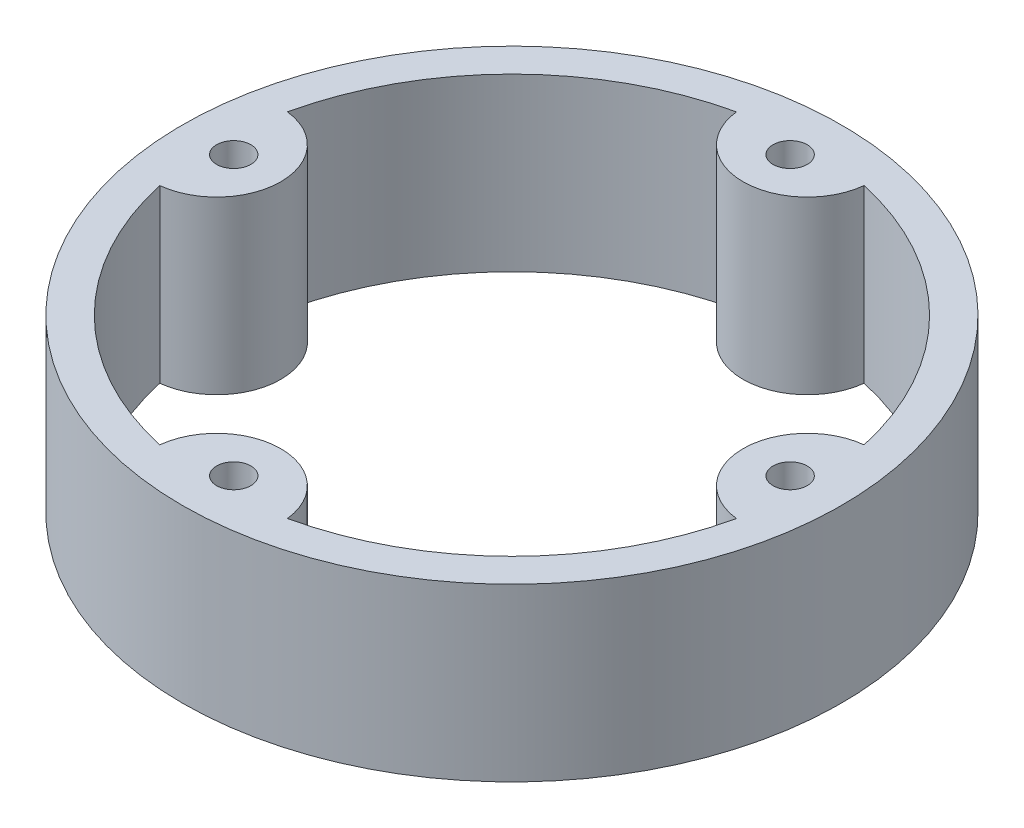
ISO-10303-21;
HEADER;
FILE_DESCRIPTION(('STEP AP214'),'2;1');
FILE_NAME('part.step','',(''),(''),'','','');
FILE_SCHEMA(('AUTOMOTIVE_DESIGN { 1 0 10303 214 1 1 1 1 }'));
ENDSEC;
DATA;
#1=APPLICATION_CONTEXT('core data for automotive mechanical design processes');
#2=APPLICATION_PROTOCOL_DEFINITION('international standard','automotive_design',2000,#1);
#3=PRODUCT_CONTEXT('',#1,'mechanical');
#4=PRODUCT('Part','Part','',(#3));
#5=PRODUCT_RELATED_PRODUCT_CATEGORY('part','',(#4));
#6=PRODUCT_DEFINITION_FORMATION('','',#4);
#7=PRODUCT_DEFINITION_CONTEXT('part definition',#1,'design');
#8=PRODUCT_DEFINITION('design','',#6,#7);
#9=PRODUCT_DEFINITION_SHAPE('','',#8);
#10=(LENGTH_UNIT() NAMED_UNIT(*) SI_UNIT(.MILLI.,.METRE.));
#11=(NAMED_UNIT(*) PLANE_ANGLE_UNIT() SI_UNIT($,.RADIAN.));
#12=(NAMED_UNIT(*) SI_UNIT($,.STERADIAN.) SOLID_ANGLE_UNIT());
#13=UNCERTAINTY_MEASURE_WITH_UNIT(LENGTH_MEASURE(1.E-05),#10,'distance_accuracy_value','');
#14=(GEOMETRIC_REPRESENTATION_CONTEXT(3) GLOBAL_UNCERTAINTY_ASSIGNED_CONTEXT((#13)) GLOBAL_UNIT_ASSIGNED_CONTEXT((#10,
#11,#12)) REPRESENTATION_CONTEXT('',''));
#15=CARTESIAN_POINT('',(0.,0.,0.));
#16=DIRECTION('',(0.,0.,1.));
#17=DIRECTION('',(1.,0.,0.));
#18=AXIS2_PLACEMENT_3D('',#15,#16,#17);
#19=CARTESIAN_POINT('',(0.,20.,0.));
#20=DIRECTION('',(0.,1.,0.));
#21=DIRECTION('',(0.,0.,1.));
#22=AXIS2_PLACEMENT_3D('',#19,#20,#21);
#23=PLANE('',#22);
#24=CARTESIAN_POINT('',(0.,20.,32.4999999999998));
#25=DIRECTION('',(0.,1.,0.));
#26=DIRECTION('',(0.,0.,1.));
#27=AXIS2_PLACEMENT_3D('',#24,#25,#26);
#28=CIRCLE('',#27,2.00000000000028);
#29=CARTESIAN_POINT('',(0.,20.,34.5000000000001));
#30=VERTEX_POINT('',#29);
#31=EDGE_CURVE('E193',#30,#30,#28,.T.);
#32=ORIENTED_EDGE('',*,*,#31,.F.);
#33=EDGE_LOOP('',(#32));
#34=FACE_BOUND('',#33,.T.);
#35=CARTESIAN_POINT('',(-34.5,20.,0.));
#36=DIRECTION('',(0.,-1.,0.));
#37=DIRECTION('',(0.,0.,1.));
#38=AXIS2_PLACEMENT_3D('',#35,#36,#37);
#39=CIRCLE('',#38,7.49999999999979);
#40=CARTESIAN_POINT('',(-33.6847826086957,20.,-7.4555630642435));
#41=VERTEX_POINT('',#40);
#42=CARTESIAN_POINT('',(-33.6847826086957,20.,7.4555630642435));
#43=VERTEX_POINT('',#42);
#44=EDGE_CURVE('E106',#41,#43,#39,.T.);
#45=ORIENTED_EDGE('',*,*,#44,.F.);
#46=CARTESIAN_POINT('',(0.,20.,0.));
#47=DIRECTION('',(0.,1.,0.));
#48=DIRECTION('',(0.,0.,1.));
#49=AXIS2_PLACEMENT_3D('',#46,#47,#48);
#50=CIRCLE('',#49,34.5);
#51=CARTESIAN_POINT('',(-7.45556306424351,20.,-33.6847826086957));
#52=VERTEX_POINT('',#51);
#53=EDGE_CURVE('E98',#52,#41,#50,.T.);
#54=ORIENTED_EDGE('',*,*,#53,.F.);
#55=CARTESIAN_POINT('',(0.,20.,-34.5));
#56=DIRECTION('',(0.,-1.,0.));
#57=DIRECTION('',(0.,0.,1.));
#58=AXIS2_PLACEMENT_3D('',#55,#56,#57);
#59=CIRCLE('',#58,7.49999999999981);
#60=CARTESIAN_POINT('',(7.45556306424352,20.,-33.6847826086957));
#61=VERTEX_POINT('',#60);
#62=EDGE_CURVE('E133',#61,#52,#59,.T.);
#63=ORIENTED_EDGE('',*,*,#62,.F.);
#64=CARTESIAN_POINT('',(0.,20.,0.));
#65=DIRECTION('',(0.,1.,0.));
#66=DIRECTION('',(0.,0.,1.));
#67=AXIS2_PLACEMENT_3D('',#64,#65,#66);
#68=CIRCLE('',#67,34.5);
#69=CARTESIAN_POINT('',(33.6847826086957,20.,-7.45556306424345));
#70=VERTEX_POINT('',#69);
#71=EDGE_CURVE('E131',#70,#61,#68,.T.);
#72=ORIENTED_EDGE('',*,*,#71,.F.);
#73=CARTESIAN_POINT('',(34.5,20.,0.));
#74=DIRECTION('',(0.,-1.,0.));
#75=DIRECTION('',(0.,0.,1.));
#76=AXIS2_PLACEMENT_3D('',#73,#74,#75);
#77=CIRCLE('',#76,7.49999999999974);
#78=CARTESIAN_POINT('',(33.6847826086957,20.,7.4555630642435));
#79=VERTEX_POINT('',#78);
#80=EDGE_CURVE('E129',#79,#70,#77,.T.);
#81=ORIENTED_EDGE('',*,*,#80,.F.);
#82=CARTESIAN_POINT('',(0.,20.,0.));
#83=DIRECTION('',(0.,1.,0.));
#84=DIRECTION('',(0.,0.,1.));
#85=AXIS2_PLACEMENT_3D('',#82,#83,#84);
#86=CIRCLE('',#85,34.5);
#87=CARTESIAN_POINT('',(7.4555630642438,20.,33.6847826086957));
#88=VERTEX_POINT('',#87);
#89=EDGE_CURVE('E127',#88,#79,#86,.T.);
#90=ORIENTED_EDGE('',*,*,#89,.F.);
#91=CARTESIAN_POINT('',(0.,20.,34.5));
#92=DIRECTION('',(0.,-1.,0.));
#93=DIRECTION('',(0.,0.,1.));
#94=AXIS2_PLACEMENT_3D('',#91,#92,#93);
#95=CIRCLE('',#94,7.50000000000009);
#96=CARTESIAN_POINT('',(-7.45556306424408,20.,33.6847826086956));
#97=VERTEX_POINT('',#96);
#98=EDGE_CURVE('E122',#97,#88,#95,.T.);
#99=ORIENTED_EDGE('',*,*,#98,.F.);
#100=CARTESIAN_POINT('',(0.,20.,0.));
#101=DIRECTION('',(0.,1.,0.));
#102=DIRECTION('',(0.,0.,1.));
#103=AXIS2_PLACEMENT_3D('',#100,#101,#102);
#104=CIRCLE('',#103,34.5);
#105=EDGE_CURVE('E120',#43,#97,#104,.T.);
#106=ORIENTED_EDGE('',*,*,#105,.F.);
#107=EDGE_LOOP('',(#45,#54,#63,#72,#81,#90,#99,#106));
#108=FACE_BOUND('',#107,.T.);
#109=CARTESIAN_POINT('',(0.,20.,-32.4999999999998));
#110=DIRECTION('',(0.,1.,0.));
#111=DIRECTION('',(0.,0.,1.));
#112=AXIS2_PLACEMENT_3D('',#109,#110,#111);
#113=CIRCLE('',#112,2.00000000000005);
#114=CARTESIAN_POINT('',(0.,20.,-30.4999999999998));
#115=VERTEX_POINT('',#114);
#116=EDGE_CURVE('E166',#115,#115,#113,.T.);
#117=ORIENTED_EDGE('',*,*,#116,.F.);
#118=EDGE_LOOP('',(#117));
#119=FACE_BOUND('',#118,.T.);
#120=CARTESIAN_POINT('',(0.,20.,0.));
#121=DIRECTION('',(0.,1.,0.));
#122=DIRECTION('',(0.,0.,1.));
#123=AXIS2_PLACEMENT_3D('',#120,#121,#122);
#124=CIRCLE('',#123,38.5);
#125=CARTESIAN_POINT('',(0.,20.,38.5));
#126=VERTEX_POINT('',#125);
#127=EDGE_CURVE('E11',#126,#126,#124,.T.);
#128=ORIENTED_EDGE('',*,*,#127,.T.);
#129=EDGE_LOOP('',(#128));
#130=FACE_BOUND('',#129,.T.);
#131=CARTESIAN_POINT('',(32.4999999999998,20.,0.));
#132=DIRECTION('',(0.,1.,0.));
#133=DIRECTION('',(0.,0.,1.));
#134=AXIS2_PLACEMENT_3D('',#131,#132,#133);
#135=CIRCLE('',#134,2.00000000000017);
#136=CARTESIAN_POINT('',(32.4999999999998,20.,2.00000000000016));
#137=VERTEX_POINT('',#136);
#138=EDGE_CURVE('E136',#137,#137,#135,.T.);
#139=ORIENTED_EDGE('',*,*,#138,.F.);
#140=EDGE_LOOP('',(#139));
#141=FACE_BOUND('',#140,.T.);
#142=CARTESIAN_POINT('',(-32.4999999999998,20.,0.));
#143=DIRECTION('',(0.,1.,0.));
#144=DIRECTION('',(0.,0.,1.));
#145=AXIS2_PLACEMENT_3D('',#142,#143,#144);
#146=CIRCLE('',#145,2.0000000000004);
#147=CARTESIAN_POINT('',(-32.4999999999998,20.,2.00000000000042));
#148=VERTEX_POINT('',#147);
#149=EDGE_CURVE('E200',#148,#148,#146,.T.);
#150=ORIENTED_EDGE('',*,*,#149,.F.);
#151=EDGE_LOOP('',(#150));
#152=FACE_BOUND('',#151,.T.);
#153=ADVANCED_FACE('F33',(#34,#108,#119,#130,#141,#152),#23,.T.);
#154=CARTESIAN_POINT('',(0.,0.,0.));
#155=DIRECTION('',(0.,1.,0.));
#156=DIRECTION('',(0.,0.,1.));
#157=AXIS2_PLACEMENT_3D('',#154,#155,#156);
#158=PLANE('',#157);
#159=CARTESIAN_POINT('',(0.,0.,-32.4999999999998));
#160=DIRECTION('',(0.,1.,0.));
#161=DIRECTION('',(0.,0.,1.));
#162=AXIS2_PLACEMENT_3D('',#159,#160,#161);
#163=CIRCLE('',#162,2.00000000000005);
#164=CARTESIAN_POINT('',(0.,0.,-30.4999999999998));
#165=VERTEX_POINT('',#164);
#166=EDGE_CURVE('E114',#165,#165,#163,.T.);
#167=ORIENTED_EDGE('',*,*,#166,.T.);
#168=EDGE_LOOP('',(#167));
#169=FACE_BOUND('',#168,.T.);
#170=CARTESIAN_POINT('',(0.,0.,0.));
#171=DIRECTION('',(0.,1.,0.));
#172=DIRECTION('',(0.,0.,1.));
#173=AXIS2_PLACEMENT_3D('',#170,#171,#172);
#174=CIRCLE('',#173,38.5);
#175=CARTESIAN_POINT('',(0.,0.,38.5));
#176=VERTEX_POINT('',#175);
#177=EDGE_CURVE('E37',#176,#176,#174,.T.);
#178=ORIENTED_EDGE('',*,*,#177,.F.);
#179=EDGE_LOOP('',(#178));
#180=FACE_BOUND('',#179,.T.);
#181=CARTESIAN_POINT('',(0.,0.,0.));
#182=DIRECTION('',(0.,1.,0.));
#183=DIRECTION('',(0.,0.,1.));
#184=AXIS2_PLACEMENT_3D('',#181,#182,#183);
#185=CIRCLE('',#184,34.5);
#186=CARTESIAN_POINT('',(-7.45556306424351,0.,-33.6847826086957));
#187=VERTEX_POINT('',#186);
#188=CARTESIAN_POINT('',(-33.6847826086957,0.,-7.4555630642435));
#189=VERTEX_POINT('',#188);
#190=EDGE_CURVE('E56',#187,#189,#185,.T.);
#191=ORIENTED_EDGE('',*,*,#190,.T.);
#192=CARTESIAN_POINT('',(-34.5,0.,0.));
#193=DIRECTION('',(0.,-1.,0.));
#194=DIRECTION('',(0.,0.,1.));
#195=AXIS2_PLACEMENT_3D('',#192,#193,#194);
#196=CIRCLE('',#195,7.49999999999979);
#197=CARTESIAN_POINT('',(-33.6847826086957,0.,7.4555630642435));
#198=VERTEX_POINT('',#197);
#199=EDGE_CURVE('E113',#189,#198,#196,.T.);
#200=ORIENTED_EDGE('',*,*,#199,.T.);
#201=CARTESIAN_POINT('',(0.,0.,0.));
#202=DIRECTION('',(0.,1.,0.));
#203=DIRECTION('',(0.,0.,1.));
#204=AXIS2_PLACEMENT_3D('',#201,#202,#203);
#205=CIRCLE('',#204,34.5);
#206=CARTESIAN_POINT('',(-7.45556306424408,0.,33.6847826086956));
#207=VERTEX_POINT('',#206);
#208=EDGE_CURVE('E138',#198,#207,#205,.T.);
#209=ORIENTED_EDGE('',*,*,#208,.T.);
#210=CARTESIAN_POINT('',(0.,0.,34.5));
#211=DIRECTION('',(0.,-1.,0.));
#212=DIRECTION('',(0.,0.,1.));
#213=AXIS2_PLACEMENT_3D('',#210,#211,#212);
#214=CIRCLE('',#213,7.50000000000009);
#215=CARTESIAN_POINT('',(7.4555630642438,0.,33.6847826086957));
#216=VERTEX_POINT('',#215);
#217=EDGE_CURVE('E141',#207,#216,#214,.T.);
#218=ORIENTED_EDGE('',*,*,#217,.T.);
#219=CARTESIAN_POINT('',(0.,0.,0.));
#220=DIRECTION('',(0.,1.,0.));
#221=DIRECTION('',(0.,0.,1.));
#222=AXIS2_PLACEMENT_3D('',#219,#220,#221);
#223=CIRCLE('',#222,34.5);
#224=CARTESIAN_POINT('',(33.6847826086957,0.,7.4555630642435));
#225=VERTEX_POINT('',#224);
#226=EDGE_CURVE('E144',#216,#225,#223,.T.);
#227=ORIENTED_EDGE('',*,*,#226,.T.);
#228=CARTESIAN_POINT('',(34.5,0.,0.));
#229=DIRECTION('',(0.,-1.,0.));
#230=DIRECTION('',(0.,0.,1.));
#231=AXIS2_PLACEMENT_3D('',#228,#229,#230);
#232=CIRCLE('',#231,7.49999999999974);
#233=CARTESIAN_POINT('',(33.6847826086957,0.,-7.45556306424345));
#234=VERTEX_POINT('',#233);
#235=EDGE_CURVE('E147',#225,#234,#232,.T.);
#236=ORIENTED_EDGE('',*,*,#235,.T.);
#237=CARTESIAN_POINT('',(0.,0.,0.));
#238=DIRECTION('',(0.,1.,0.));
#239=DIRECTION('',(0.,0.,1.));
#240=AXIS2_PLACEMENT_3D('',#237,#238,#239);
#241=CIRCLE('',#240,34.5);
#242=CARTESIAN_POINT('',(7.45556306424341,0.,-33.6847826086958));
#243=VERTEX_POINT('',#242);
#244=EDGE_CURVE('E150',#234,#243,#241,.T.);
#245=ORIENTED_EDGE('',*,*,#244,.T.);
#246=CARTESIAN_POINT('',(0.,0.,-34.5));
#247=DIRECTION('',(0.,-1.,0.));
#248=DIRECTION('',(0.,0.,1.));
#249=AXIS2_PLACEMENT_3D('',#246,#247,#248);
#250=CIRCLE('',#249,7.49999999999981);
#251=EDGE_CURVE('E107',#243,#187,#250,.T.);
#252=ORIENTED_EDGE('',*,*,#251,.T.);
#253=EDGE_LOOP('',(#191,#200,#209,#218,#227,#236,#245,#252));
#254=FACE_BOUND('',#253,.T.);
#255=CARTESIAN_POINT('',(32.4999999999998,0.,0.));
#256=DIRECTION('',(0.,1.,0.));
#257=DIRECTION('',(0.,0.,1.));
#258=AXIS2_PLACEMENT_3D('',#255,#256,#257);
#259=CIRCLE('',#258,2.00000000000017);
#260=CARTESIAN_POINT('',(32.4999999999998,0.,2.00000000000016));
#261=VERTEX_POINT('',#260);
#262=EDGE_CURVE('E195',#261,#261,#259,.T.);
#263=ORIENTED_EDGE('',*,*,#262,.T.);
#264=EDGE_LOOP('',(#263));
#265=FACE_BOUND('',#264,.T.);
#266=CARTESIAN_POINT('',(0.,0.,32.4999999999998));
#267=DIRECTION('',(0.,1.,0.));
#268=DIRECTION('',(0.,0.,1.));
#269=AXIS2_PLACEMENT_3D('',#266,#267,#268);
#270=CIRCLE('',#269,2.00000000000028);
#271=CARTESIAN_POINT('',(0.,0.,34.5000000000001));
#272=VERTEX_POINT('',#271);
#273=EDGE_CURVE('E196',#272,#272,#270,.T.);
#274=ORIENTED_EDGE('',*,*,#273,.T.);
#275=EDGE_LOOP('',(#274));
#276=FACE_BOUND('',#275,.T.);
#277=CARTESIAN_POINT('',(-32.4999999999998,0.,0.));
#278=DIRECTION('',(0.,1.,0.));
#279=DIRECTION('',(0.,0.,1.));
#280=AXIS2_PLACEMENT_3D('',#277,#278,#279);
#281=CIRCLE('',#280,2.0000000000004);
#282=CARTESIAN_POINT('',(-32.4999999999998,0.,2.00000000000042));
#283=VERTEX_POINT('',#282);
#284=EDGE_CURVE('E203',#283,#283,#281,.T.);
#285=ORIENTED_EDGE('',*,*,#284,.T.);
#286=EDGE_LOOP('',(#285));
#287=FACE_BOUND('',#286,.T.);
#288=ADVANCED_FACE('F172',(#169,#180,#254,#265,#276,#287),#158,.F.);
#289=CARTESIAN_POINT('',(0.,20.,0.));
#290=DIRECTION('',(0.,-1.,0.));
#291=DIRECTION('',(0.,0.,-1.));
#292=AXIS2_PLACEMENT_3D('',#289,#290,#291);
#293=CYLINDRICAL_SURFACE('',#292,38.5);
#294=ORIENTED_EDGE('',*,*,#127,.F.);
#295=EDGE_LOOP('',(#294));
#296=FACE_BOUND('',#295,.T.);
#297=ORIENTED_EDGE('',*,*,#177,.T.);
#298=EDGE_LOOP('',(#297));
#299=FACE_BOUND('',#298,.T.);
#300=ADVANCED_FACE('F35',(#296,#299),#293,.T.);
#301=CARTESIAN_POINT('',(0.,20.,-32.4999999999998));
#302=DIRECTION('',(0.,-1.,0.));
#303=DIRECTION('',(0.,0.,-1.));
#304=AXIS2_PLACEMENT_3D('',#301,#302,#303);
#305=CYLINDRICAL_SURFACE('',#304,2.00000000000005);
#306=ORIENTED_EDGE('',*,*,#116,.T.);
#307=EDGE_LOOP('',(#306));
#308=FACE_BOUND('',#307,.T.);
#309=ORIENTED_EDGE('',*,*,#166,.F.);
#310=EDGE_LOOP('',(#309));
#311=FACE_BOUND('',#310,.T.);
#312=ADVANCED_FACE('F175',(#308,#311),#305,.F.);
#313=CARTESIAN_POINT('',(0.,20.,0.));
#314=DIRECTION('',(0.,-1.,0.));
#315=DIRECTION('',(0.,0.,-1.));
#316=AXIS2_PLACEMENT_3D('',#313,#314,#315);
#317=CYLINDRICAL_SURFACE('',#316,34.5);
#318=ORIENTED_EDGE('',*,*,#190,.F.);
#319=DIRECTION('',(0.,-1.,0.));
#320=VECTOR('',#319,1.);
#321=CARTESIAN_POINT('',(-7.45556306424351,20.,-33.6847826086957));
#322=LINE('',#321,#320);
#323=EDGE_CURVE('E102',#52,#187,#322,.T.);
#324=ORIENTED_EDGE('',*,*,#323,.F.);
#325=ORIENTED_EDGE('',*,*,#53,.T.);
#326=DIRECTION('',(0.,-1.,0.));
#327=VECTOR('',#326,1.);
#328=CARTESIAN_POINT('',(-33.6847826086957,20.,-7.4555630642435));
#329=LINE('',#328,#327);
#330=EDGE_CURVE('E101',#41,#189,#329,.T.);
#331=ORIENTED_EDGE('',*,*,#330,.T.);
#332=EDGE_LOOP('',(#318,#324,#325,#331));
#333=FACE_BOUND('',#332,.T.);
#334=ADVANCED_FACE('F100',(#333),#317,.F.);
#335=CARTESIAN_POINT('',(-34.5,20.,0.));
#336=DIRECTION('',(0.,-1.,0.));
#337=DIRECTION('',(0.,0.,-1.));
#338=AXIS2_PLACEMENT_3D('',#335,#336,#337);
#339=CYLINDRICAL_SURFACE('',#338,7.49999999999979);
#340=ORIENTED_EDGE('',*,*,#199,.F.);
#341=ORIENTED_EDGE('',*,*,#330,.F.);
#342=ORIENTED_EDGE('',*,*,#44,.T.);
#343=DIRECTION('',(0.,-1.,0.));
#344=VECTOR('',#343,1.);
#345=CARTESIAN_POINT('',(-33.6847826086957,20.,7.4555630642435));
#346=LINE('',#345,#344);
#347=EDGE_CURVE('E115',#43,#198,#346,.T.);
#348=ORIENTED_EDGE('',*,*,#347,.T.);
#349=EDGE_LOOP('',(#340,#341,#342,#348));
#350=FACE_BOUND('',#349,.T.);
#351=ADVANCED_FACE('F110',(#350),#339,.T.);
#352=CARTESIAN_POINT('',(0.,20.,0.));
#353=DIRECTION('',(0.,-1.,0.));
#354=DIRECTION('',(0.,0.,-1.));
#355=AXIS2_PLACEMENT_3D('',#352,#353,#354);
#356=CYLINDRICAL_SURFACE('',#355,34.5);
#357=ORIENTED_EDGE('',*,*,#208,.F.);
#358=ORIENTED_EDGE('',*,*,#347,.F.);
#359=ORIENTED_EDGE('',*,*,#105,.T.);
#360=DIRECTION('',(0.,-1.,0.));
#361=VECTOR('',#360,1.);
#362=CARTESIAN_POINT('',(-7.45556306424408,20.,33.6847826086956));
#363=LINE('',#362,#361);
#364=EDGE_CURVE('E163',#97,#207,#363,.T.);
#365=ORIENTED_EDGE('',*,*,#364,.T.);
#366=EDGE_LOOP('',(#357,#358,#359,#365));
#367=FACE_BOUND('',#366,.T.);
#368=ADVANCED_FACE('F249',(#367),#356,.F.);
#369=CARTESIAN_POINT('',(0.,20.,34.5));
#370=DIRECTION('',(0.,-1.,0.));
#371=DIRECTION('',(0.,0.,-1.));
#372=AXIS2_PLACEMENT_3D('',#369,#370,#371);
#373=CYLINDRICAL_SURFACE('',#372,7.50000000000009);
#374=ORIENTED_EDGE('',*,*,#217,.F.);
#375=ORIENTED_EDGE('',*,*,#364,.F.);
#376=ORIENTED_EDGE('',*,*,#98,.T.);
#377=DIRECTION('',(0.,-1.,0.));
#378=VECTOR('',#377,1.);
#379=CARTESIAN_POINT('',(7.4555630642438,20.,33.6847826086957));
#380=LINE('',#379,#378);
#381=EDGE_CURVE('E161',#88,#216,#380,.T.);
#382=ORIENTED_EDGE('',*,*,#381,.T.);
#383=EDGE_LOOP('',(#374,#375,#376,#382));
#384=FACE_BOUND('',#383,.T.);
#385=ADVANCED_FACE('F245',(#384),#373,.T.);
#386=CARTESIAN_POINT('',(0.,20.,0.));
#387=DIRECTION('',(0.,-1.,0.));
#388=DIRECTION('',(0.,0.,-1.));
#389=AXIS2_PLACEMENT_3D('',#386,#387,#388);
#390=CYLINDRICAL_SURFACE('',#389,34.5);
#391=ORIENTED_EDGE('',*,*,#226,.F.);
#392=ORIENTED_EDGE('',*,*,#381,.F.);
#393=ORIENTED_EDGE('',*,*,#89,.T.);
#394=DIRECTION('',(0.,-1.,0.));
#395=VECTOR('',#394,1.);
#396=CARTESIAN_POINT('',(33.6847826086957,20.,7.4555630642435));
#397=LINE('',#396,#395);
#398=EDGE_CURVE('E159',#79,#225,#397,.T.);
#399=ORIENTED_EDGE('',*,*,#398,.T.);
#400=EDGE_LOOP('',(#391,#392,#393,#399));
#401=FACE_BOUND('',#400,.T.);
#402=ADVANCED_FACE('F241',(#401),#390,.F.);
#403=CARTESIAN_POINT('',(34.5,20.,0.));
#404=DIRECTION('',(0.,-1.,0.));
#405=DIRECTION('',(0.,0.,-1.));
#406=AXIS2_PLACEMENT_3D('',#403,#404,#405);
#407=CYLINDRICAL_SURFACE('',#406,7.49999999999974);
#408=ORIENTED_EDGE('',*,*,#235,.F.);
#409=ORIENTED_EDGE('',*,*,#398,.F.);
#410=ORIENTED_EDGE('',*,*,#80,.T.);
#411=DIRECTION('',(0.,-1.,0.));
#412=VECTOR('',#411,1.);
#413=CARTESIAN_POINT('',(33.6847826086957,20.,-7.45556306424345));
#414=LINE('',#413,#412);
#415=EDGE_CURVE('E157',#70,#234,#414,.T.);
#416=ORIENTED_EDGE('',*,*,#415,.T.);
#417=EDGE_LOOP('',(#408,#409,#410,#416));
#418=FACE_BOUND('',#417,.T.);
#419=ADVANCED_FACE('F237',(#418),#407,.T.);
#420=CARTESIAN_POINT('',(0.,20.,0.));
#421=DIRECTION('',(0.,-1.,0.));
#422=DIRECTION('',(0.,0.,-1.));
#423=AXIS2_PLACEMENT_3D('',#420,#421,#422);
#424=CYLINDRICAL_SURFACE('',#423,34.5);
#425=ORIENTED_EDGE('',*,*,#244,.F.);
#426=ORIENTED_EDGE('',*,*,#415,.F.);
#427=ORIENTED_EDGE('',*,*,#71,.T.);
#428=DIRECTION('',(0.,-1.,0.));
#429=VECTOR('',#428,1.);
#430=CARTESIAN_POINT('',(7.45556306424341,20.,-33.6847826086958));
#431=LINE('',#430,#429);
#432=EDGE_CURVE('E48',#61,#243,#431,.T.);
#433=ORIENTED_EDGE('',*,*,#432,.T.);
#434=EDGE_LOOP('',(#425,#426,#427,#433));
#435=FACE_BOUND('',#434,.T.);
#436=ADVANCED_FACE('F234',(#435),#424,.F.);
#437=CARTESIAN_POINT('',(0.,20.,-34.5));
#438=DIRECTION('',(0.,-1.,0.));
#439=DIRECTION('',(0.,0.,-1.));
#440=AXIS2_PLACEMENT_3D('',#437,#438,#439);
#441=CYLINDRICAL_SURFACE('',#440,7.49999999999981);
#442=ORIENTED_EDGE('',*,*,#251,.F.);
#443=ORIENTED_EDGE('',*,*,#432,.F.);
#444=ORIENTED_EDGE('',*,*,#62,.T.);
#445=ORIENTED_EDGE('',*,*,#323,.T.);
#446=EDGE_LOOP('',(#442,#443,#444,#445));
#447=FACE_BOUND('',#446,.T.);
#448=ADVANCED_FACE('F231',(#447),#441,.T.);
#449=CARTESIAN_POINT('',(32.4999999999998,20.,0.));
#450=DIRECTION('',(0.,-1.,0.));
#451=DIRECTION('',(0.,0.,-1.));
#452=AXIS2_PLACEMENT_3D('',#449,#450,#451);
#453=CYLINDRICAL_SURFACE('',#452,2.00000000000017);
#454=ORIENTED_EDGE('',*,*,#138,.T.);
#455=EDGE_LOOP('',(#454));
#456=FACE_BOUND('',#455,.T.);
#457=ORIENTED_EDGE('',*,*,#262,.F.);
#458=EDGE_LOOP('',(#457));
#459=FACE_BOUND('',#458,.T.);
#460=ADVANCED_FACE('F209',(#456,#459),#453,.F.);
#461=CARTESIAN_POINT('',(0.,20.,32.4999999999998));
#462=DIRECTION('',(0.,-1.,0.));
#463=DIRECTION('',(0.,0.,-1.));
#464=AXIS2_PLACEMENT_3D('',#461,#462,#463);
#465=CYLINDRICAL_SURFACE('',#464,2.00000000000028);
#466=ORIENTED_EDGE('',*,*,#31,.T.);
#467=EDGE_LOOP('',(#466));
#468=FACE_BOUND('',#467,.T.);
#469=ORIENTED_EDGE('',*,*,#273,.F.);
#470=EDGE_LOOP('',(#469));
#471=FACE_BOUND('',#470,.T.);
#472=ADVANCED_FACE('F222',(#468,#471),#465,.F.);
#473=CARTESIAN_POINT('',(-32.4999999999998,20.,0.));
#474=DIRECTION('',(0.,-1.,0.));
#475=DIRECTION('',(0.,0.,-1.));
#476=AXIS2_PLACEMENT_3D('',#473,#474,#475);
#477=CYLINDRICAL_SURFACE('',#476,2.0000000000004);
#478=ORIENTED_EDGE('',*,*,#149,.T.);
#479=EDGE_LOOP('',(#478));
#480=FACE_BOUND('',#479,.T.);
#481=ORIENTED_EDGE('',*,*,#284,.F.);
#482=EDGE_LOOP('',(#481));
#483=FACE_BOUND('',#482,.T.);
#484=ADVANCED_FACE('F220',(#480,#483),#477,.F.);
#485=CLOSED_SHELL('',(#153,#288,#300,#312,#334,#351,#368,#385,#402,#419,#436,#448,#460,#472,#484));
#486=MANIFOLD_SOLID_BREP('B2',#485);
#487=ADVANCED_BREP_SHAPE_REPRESENTATION('',(#18,#486),#14);
#488=SHAPE_DEFINITION_REPRESENTATION(#9,#487);
ENDSEC;
END-ISO-10303-21;
